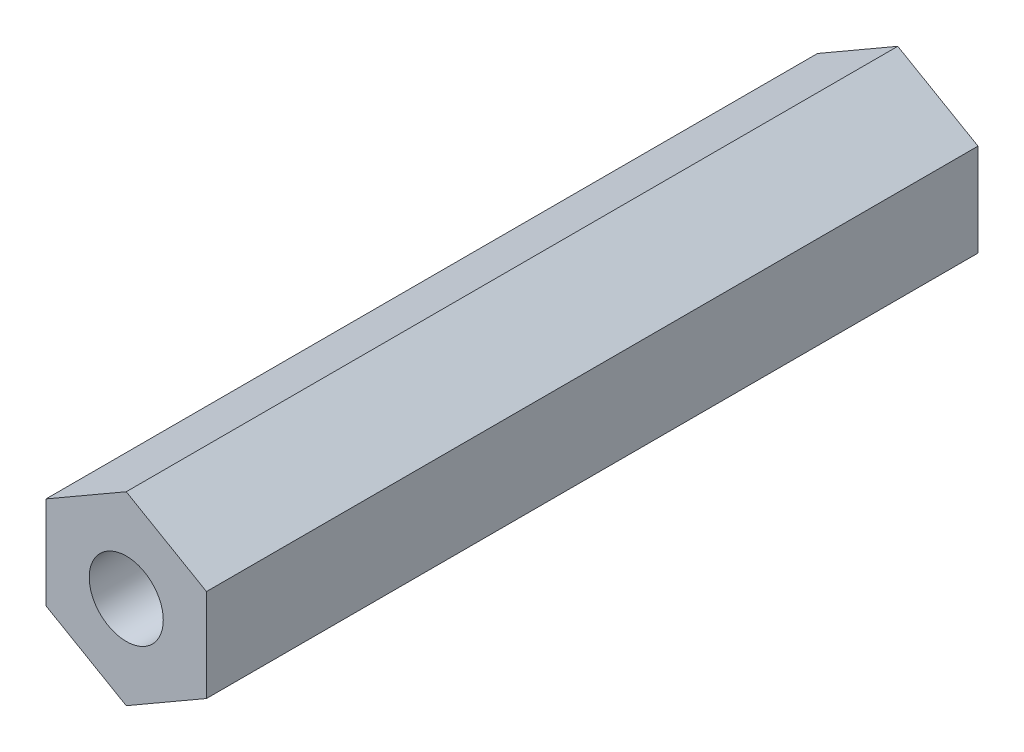
ISO-10303-21;
HEADER;
FILE_DESCRIPTION(('STEP AP214'),'2;1');
FILE_NAME('part.step','',(''),(''),'','','');
FILE_SCHEMA(('AUTOMOTIVE_DESIGN { 1 0 10303 214 1 1 1 1 }'));
ENDSEC;
DATA;
#1=APPLICATION_CONTEXT('core data for automotive mechanical design processes');
#2=APPLICATION_PROTOCOL_DEFINITION('international standard','automotive_design',2000,#1);
#3=PRODUCT_CONTEXT('',#1,'mechanical');
#4=PRODUCT('Part','Part','',(#3));
#5=PRODUCT_RELATED_PRODUCT_CATEGORY('part','',(#4));
#6=PRODUCT_DEFINITION_FORMATION('','',#4);
#7=PRODUCT_DEFINITION_CONTEXT('part definition',#1,'design');
#8=PRODUCT_DEFINITION('design','',#6,#7);
#9=PRODUCT_DEFINITION_SHAPE('','',#8);
#10=(LENGTH_UNIT() NAMED_UNIT(*) SI_UNIT(.MILLI.,.METRE.));
#11=(NAMED_UNIT(*) PLANE_ANGLE_UNIT() SI_UNIT($,.RADIAN.));
#12=(NAMED_UNIT(*) SI_UNIT($,.STERADIAN.) SOLID_ANGLE_UNIT());
#13=UNCERTAINTY_MEASURE_WITH_UNIT(LENGTH_MEASURE(1.E-05),#10,'distance_accuracy_value','');
#14=(GEOMETRIC_REPRESENTATION_CONTEXT(3) GLOBAL_UNCERTAINTY_ASSIGNED_CONTEXT((#13)) GLOBAL_UNIT_ASSIGNED_CONTEXT((#10,
#11,#12)) REPRESENTATION_CONTEXT('',''));
#15=CARTESIAN_POINT('',(0.,0.,0.));
#16=DIRECTION('',(0.,0.,1.));
#17=DIRECTION('',(1.,0.,0.));
#18=AXIS2_PLACEMENT_3D('',#15,#16,#17);
#19=CARTESIAN_POINT('',(0.,0.,25.));
#20=DIRECTION('',(0.,0.,1.));
#21=DIRECTION('',(1.,0.,0.));
#22=AXIS2_PLACEMENT_3D('',#19,#20,#21);
#23=PLANE('',#22);
#24=DIRECTION('',(-0.866025403784439,-0.5,0.));
#25=VECTOR('',#24,1.);
#26=CARTESIAN_POINT('',(0.,3.00222139978606,25.));
#27=LINE('',#26,#25);
#28=CARTESIAN_POINT('',(0.,3.00222139978606,25.));
#29=VERTEX_POINT('',#28);
#30=CARTESIAN_POINT('',(-2.6,1.50111069989303,25.));
#31=VERTEX_POINT('',#30);
#32=EDGE_CURVE('E132',#29,#31,#27,.T.);
#33=ORIENTED_EDGE('',*,*,#32,.T.);
#34=DIRECTION('',(0.,-1.,0.));
#35=VECTOR('',#34,1.);
#36=CARTESIAN_POINT('',(-2.6,1.50111069989303,25.));
#37=LINE('',#36,#35);
#38=CARTESIAN_POINT('',(-2.6,-1.50111069989303,25.));
#39=VERTEX_POINT('',#38);
#40=EDGE_CURVE('E90',#31,#39,#37,.T.);
#41=ORIENTED_EDGE('',*,*,#40,.T.);
#42=DIRECTION('',(0.866025403784438,-0.500000000000001,0.));
#43=VECTOR('',#42,1.);
#44=CARTESIAN_POINT('',(-2.6,-1.50111069989303,25.));
#45=LINE('',#44,#43);
#46=CARTESIAN_POINT('',(0.,-3.00222139978605,25.));
#47=VERTEX_POINT('',#46);
#48=EDGE_CURVE('E103',#39,#47,#45,.T.);
#49=ORIENTED_EDGE('',*,*,#48,.T.);
#50=DIRECTION('',(0.866025403784439,0.5,0.));
#51=VECTOR('',#50,1.);
#52=CARTESIAN_POINT('',(0.,-3.00222139978605,25.));
#53=LINE('',#52,#51);
#54=CARTESIAN_POINT('',(2.6,-1.50111069989303,25.));
#55=VERTEX_POINT('',#54);
#56=EDGE_CURVE('E97',#47,#55,#53,.T.);
#57=ORIENTED_EDGE('',*,*,#56,.T.);
#58=DIRECTION('',(0.,1.,0.));
#59=VECTOR('',#58,1.);
#60=CARTESIAN_POINT('',(2.6,-1.50111069989303,25.));
#61=LINE('',#60,#59);
#62=CARTESIAN_POINT('',(2.6,1.50111069989303,25.));
#63=VERTEX_POINT('',#62);
#64=EDGE_CURVE('E101',#55,#63,#61,.T.);
#65=ORIENTED_EDGE('',*,*,#64,.T.);
#66=DIRECTION('',(-0.866025403784439,0.5,0.));
#67=VECTOR('',#66,1.);
#68=CARTESIAN_POINT('',(2.6,1.50111069989303,25.));
#69=LINE('',#68,#67);
#70=EDGE_CURVE('E53',#63,#29,#69,.T.);
#71=ORIENTED_EDGE('',*,*,#70,.T.);
#72=EDGE_LOOP('',(#33,#41,#49,#57,#65,#71));
#73=FACE_BOUND('',#72,.T.);
#74=CARTESIAN_POINT('',(0.,0.,25.));
#75=DIRECTION('',(0.,0.,1.));
#76=DIRECTION('',(1.,0.,0.));
#77=AXIS2_PLACEMENT_3D('',#74,#75,#76);
#78=CIRCLE('',#77,1.2);
#79=CARTESIAN_POINT('',(1.2,0.,25.));
#80=VERTEX_POINT('',#79);
#81=EDGE_CURVE('E125',#80,#80,#78,.T.);
#82=ORIENTED_EDGE('',*,*,#81,.F.);
#83=EDGE_LOOP('',(#82));
#84=FACE_BOUND('',#83,.T.);
#85=ADVANCED_FACE('F36',(#73,#84),#23,.T.);
#86=CARTESIAN_POINT('',(0.,0.,0.));
#87=DIRECTION('',(0.,0.,1.));
#88=DIRECTION('',(1.,0.,0.));
#89=AXIS2_PLACEMENT_3D('',#86,#87,#88);
#90=PLANE('',#89);
#91=DIRECTION('',(-0.866025403784439,-0.5,0.));
#92=VECTOR('',#91,1.);
#93=CARTESIAN_POINT('',(0.,3.00222139978606,0.));
#94=LINE('',#93,#92);
#95=CARTESIAN_POINT('',(0.,3.00222139978606,0.));
#96=VERTEX_POINT('',#95);
#97=CARTESIAN_POINT('',(-2.6,1.50111069989303,0.));
#98=VERTEX_POINT('',#97);
#99=EDGE_CURVE('E121',#96,#98,#94,.T.);
#100=ORIENTED_EDGE('',*,*,#99,.F.);
#101=DIRECTION('',(-0.866025403784439,0.5,0.));
#102=VECTOR('',#101,1.);
#103=CARTESIAN_POINT('',(2.6,1.50111069989303,0.));
#104=LINE('',#103,#102);
#105=CARTESIAN_POINT('',(2.6,1.50111069989303,0.));
#106=VERTEX_POINT('',#105);
#107=EDGE_CURVE('E82',#106,#96,#104,.T.);
#108=ORIENTED_EDGE('',*,*,#107,.F.);
#109=DIRECTION('',(0.,1.,0.));
#110=VECTOR('',#109,1.);
#111=CARTESIAN_POINT('',(2.6,-1.50111069989303,0.));
#112=LINE('',#111,#110);
#113=CARTESIAN_POINT('',(2.6,-1.50111069989303,0.));
#114=VERTEX_POINT('',#113);
#115=EDGE_CURVE('E76',#114,#106,#112,.T.);
#116=ORIENTED_EDGE('',*,*,#115,.F.);
#117=DIRECTION('',(0.866025403784439,0.5,0.));
#118=VECTOR('',#117,1.);
#119=CARTESIAN_POINT('',(0.,-3.00222139978605,0.));
#120=LINE('',#119,#118);
#121=CARTESIAN_POINT('',(0.,-3.00222139978605,0.));
#122=VERTEX_POINT('',#121);
#123=EDGE_CURVE('E111',#122,#114,#120,.T.);
#124=ORIENTED_EDGE('',*,*,#123,.F.);
#125=DIRECTION('',(0.866025403784438,-0.500000000000001,0.));
#126=VECTOR('',#125,1.);
#127=CARTESIAN_POINT('',(-2.6,-1.50111069989303,0.));
#128=LINE('',#127,#126);
#129=CARTESIAN_POINT('',(-2.6,-1.50111069989303,0.));
#130=VERTEX_POINT('',#129);
#131=EDGE_CURVE('E127',#130,#122,#128,.T.);
#132=ORIENTED_EDGE('',*,*,#131,.F.);
#133=DIRECTION('',(0.,-1.,0.));
#134=VECTOR('',#133,1.);
#135=CARTESIAN_POINT('',(-2.6,1.50111069989303,0.));
#136=LINE('',#135,#134);
#137=EDGE_CURVE('E124',#98,#130,#136,.T.);
#138=ORIENTED_EDGE('',*,*,#137,.F.);
#139=EDGE_LOOP('',(#100,#108,#116,#124,#132,#138));
#140=FACE_BOUND('',#139,.T.);
#141=CARTESIAN_POINT('',(0.,0.,0.));
#142=DIRECTION('',(0.,0.,1.));
#143=DIRECTION('',(1.,0.,0.));
#144=AXIS2_PLACEMENT_3D('',#141,#142,#143);
#145=CIRCLE('',#144,1.2);
#146=CARTESIAN_POINT('',(1.2,0.,0.));
#147=VERTEX_POINT('',#146);
#148=EDGE_CURVE('E225',#147,#147,#145,.T.);
#149=ORIENTED_EDGE('',*,*,#148,.T.);
#150=EDGE_LOOP('',(#149));
#151=FACE_BOUND('',#150,.T.);
#152=ADVANCED_FACE('F141',(#140,#151),#90,.F.);
#153=CARTESIAN_POINT('',(0.,3.00222139978606,25.));
#154=DIRECTION('',(0.5,-0.866025403784438,0.));
#155=DIRECTION('',(0.866025403784438,0.5,0.));
#156=AXIS2_PLACEMENT_3D('',#153,#154,#155);
#157=PLANE('',#156);
#158=ORIENTED_EDGE('',*,*,#99,.T.);
#159=DIRECTION('',(0.,0.,-1.));
#160=VECTOR('',#159,1.);
#161=CARTESIAN_POINT('',(-2.6,1.50111069989303,25.));
#162=LINE('',#161,#160);
#163=EDGE_CURVE('E11',#31,#98,#162,.T.);
#164=ORIENTED_EDGE('',*,*,#163,.F.);
#165=ORIENTED_EDGE('',*,*,#32,.F.);
#166=DIRECTION('',(0.,0.,-1.));
#167=VECTOR('',#166,1.);
#168=CARTESIAN_POINT('',(0.,3.00222139978606,25.));
#169=LINE('',#168,#167);
#170=EDGE_CURVE('E117',#29,#96,#169,.T.);
#171=ORIENTED_EDGE('',*,*,#170,.T.);
#172=EDGE_LOOP('',(#158,#164,#165,#171));
#173=FACE_BOUND('',#172,.T.);
#174=ADVANCED_FACE('F38',(#173),#157,.F.);
#175=CARTESIAN_POINT('',(-2.6,1.50111069989303,25.));
#176=DIRECTION('',(1.,0.,0.));
#177=DIRECTION('',(0.,0.,-1.));
#178=AXIS2_PLACEMENT_3D('',#175,#176,#177);
#179=PLANE('',#178);
#180=ORIENTED_EDGE('',*,*,#137,.T.);
#181=DIRECTION('',(0.,0.,-1.));
#182=VECTOR('',#181,1.);
#183=CARTESIAN_POINT('',(-2.6,-1.50111069989303,25.));
#184=LINE('',#183,#182);
#185=EDGE_CURVE('E45',#39,#130,#184,.T.);
#186=ORIENTED_EDGE('',*,*,#185,.F.);
#187=ORIENTED_EDGE('',*,*,#40,.F.);
#188=ORIENTED_EDGE('',*,*,#163,.T.);
#189=EDGE_LOOP('',(#180,#186,#187,#188));
#190=FACE_BOUND('',#189,.T.);
#191=ADVANCED_FACE('F166',(#190),#179,.F.);
#192=CARTESIAN_POINT('',(-2.6,-1.50111069989303,25.));
#193=DIRECTION('',(0.500000000000001,0.866025403784438,0.));
#194=DIRECTION('',(-0.866025403784438,0.500000000000001,0.));
#195=AXIS2_PLACEMENT_3D('',#192,#193,#194);
#196=PLANE('',#195);
#197=ORIENTED_EDGE('',*,*,#131,.T.);
#198=DIRECTION('',(0.,0.,-1.));
#199=VECTOR('',#198,1.);
#200=CARTESIAN_POINT('',(0.,-3.00222139978605,25.));
#201=LINE('',#200,#199);
#202=EDGE_CURVE('E112',#47,#122,#201,.T.);
#203=ORIENTED_EDGE('',*,*,#202,.F.);
#204=ORIENTED_EDGE('',*,*,#48,.F.);
#205=ORIENTED_EDGE('',*,*,#185,.T.);
#206=EDGE_LOOP('',(#197,#203,#204,#205));
#207=FACE_BOUND('',#206,.T.);
#208=ADVANCED_FACE('F138',(#207),#196,.F.);
#209=CARTESIAN_POINT('',(0.,-3.00222139978605,25.));
#210=DIRECTION('',(-0.5,0.866025403784439,0.));
#211=DIRECTION('',(-0.866025403784439,-0.5,0.));
#212=AXIS2_PLACEMENT_3D('',#209,#210,#211);
#213=PLANE('',#212);
#214=ORIENTED_EDGE('',*,*,#123,.T.);
#215=DIRECTION('',(0.,0.,-1.));
#216=VECTOR('',#215,1.);
#217=CARTESIAN_POINT('',(2.6,-1.50111069989303,25.));
#218=LINE('',#217,#216);
#219=EDGE_CURVE('E108',#55,#114,#218,.T.);
#220=ORIENTED_EDGE('',*,*,#219,.F.);
#221=ORIENTED_EDGE('',*,*,#56,.F.);
#222=ORIENTED_EDGE('',*,*,#202,.T.);
#223=EDGE_LOOP('',(#214,#220,#221,#222));
#224=FACE_BOUND('',#223,.T.);
#225=ADVANCED_FACE('F109',(#224),#213,.F.);
#226=CARTESIAN_POINT('',(2.6,-1.50111069989303,25.));
#227=DIRECTION('',(-1.,0.,0.));
#228=DIRECTION('',(0.,0.,1.));
#229=AXIS2_PLACEMENT_3D('',#226,#227,#228);
#230=PLANE('',#229);
#231=ORIENTED_EDGE('',*,*,#115,.T.);
#232=DIRECTION('',(0.,0.,-1.));
#233=VECTOR('',#232,1.);
#234=CARTESIAN_POINT('',(2.6,1.50111069989303,25.));
#235=LINE('',#234,#233);
#236=EDGE_CURVE('E113',#63,#106,#235,.T.);
#237=ORIENTED_EDGE('',*,*,#236,.F.);
#238=ORIENTED_EDGE('',*,*,#64,.F.);
#239=ORIENTED_EDGE('',*,*,#219,.T.);
#240=EDGE_LOOP('',(#231,#237,#238,#239));
#241=FACE_BOUND('',#240,.T.);
#242=ADVANCED_FACE('F115',(#241),#230,.F.);
#243=CARTESIAN_POINT('',(2.6,1.50111069989303,25.));
#244=DIRECTION('',(-0.5,-0.866025403784439,0.));
#245=DIRECTION('',(0.866025403784439,-0.5,0.));
#246=AXIS2_PLACEMENT_3D('',#243,#244,#245);
#247=PLANE('',#246);
#248=ORIENTED_EDGE('',*,*,#107,.T.);
#249=ORIENTED_EDGE('',*,*,#170,.F.);
#250=ORIENTED_EDGE('',*,*,#70,.F.);
#251=ORIENTED_EDGE('',*,*,#236,.T.);
#252=EDGE_LOOP('',(#248,#249,#250,#251));
#253=FACE_BOUND('',#252,.T.);
#254=ADVANCED_FACE('F146',(#253),#247,.F.);
#255=CARTESIAN_POINT('',(0.,0.,25.));
#256=DIRECTION('',(0.,0.,-1.));
#257=DIRECTION('',(-1.,0.,0.));
#258=AXIS2_PLACEMENT_3D('',#255,#256,#257);
#259=CYLINDRICAL_SURFACE('',#258,1.2);
#260=ORIENTED_EDGE('',*,*,#81,.T.);
#261=EDGE_LOOP('',(#260));
#262=FACE_BOUND('',#261,.T.);
#263=ORIENTED_EDGE('',*,*,#148,.F.);
#264=EDGE_LOOP('',(#263));
#265=FACE_BOUND('',#264,.T.);
#266=ADVANCED_FACE('F148',(#262,#265),#259,.F.);
#267=CLOSED_SHELL('',(#85,#152,#174,#191,#208,#225,#242,#254,#266));
#268=MANIFOLD_SOLID_BREP('B2',#267);
#269=ADVANCED_BREP_SHAPE_REPRESENTATION('',(#18,#268),#14);
#270=SHAPE_DEFINITION_REPRESENTATION(#9,#269);
ENDSEC;
END-ISO-10303-21;
